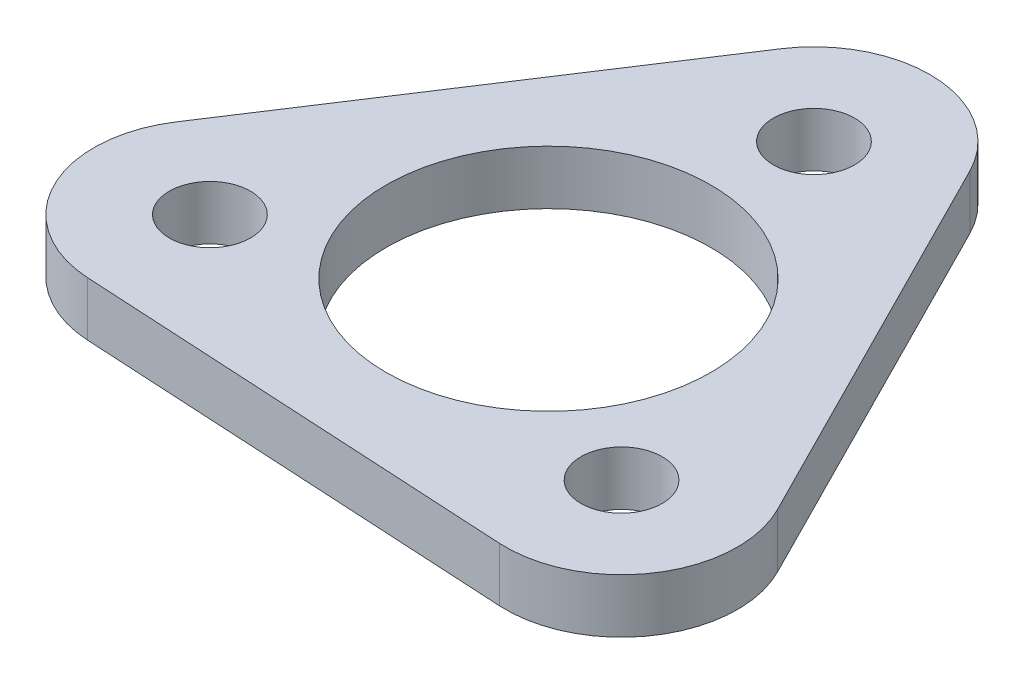
ISO-10303-21;
HEADER;
FILE_DESCRIPTION(('STEP AP214'),'2;1');
FILE_NAME('part.step','',(''),(''),'','','');
FILE_SCHEMA(('AUTOMOTIVE_DESIGN { 1 0 10303 214 1 1 1 1 }'));
ENDSEC;
DATA;
#1=APPLICATION_CONTEXT('core data for automotive mechanical design processes');
#2=APPLICATION_PROTOCOL_DEFINITION('international standard','automotive_design',2000,#1);
#3=PRODUCT_CONTEXT('',#1,'mechanical');
#4=PRODUCT('Part','Part','',(#3));
#5=PRODUCT_RELATED_PRODUCT_CATEGORY('part','',(#4));
#6=PRODUCT_DEFINITION_FORMATION('','',#4);
#7=PRODUCT_DEFINITION_CONTEXT('part definition',#1,'design');
#8=PRODUCT_DEFINITION('design','',#6,#7);
#9=PRODUCT_DEFINITION_SHAPE('','',#8);
#10=(LENGTH_UNIT() NAMED_UNIT(*) SI_UNIT(.MILLI.,.METRE.));
#11=(NAMED_UNIT(*) PLANE_ANGLE_UNIT() SI_UNIT($,.RADIAN.));
#12=(NAMED_UNIT(*) SI_UNIT($,.STERADIAN.) SOLID_ANGLE_UNIT());
#13=UNCERTAINTY_MEASURE_WITH_UNIT(LENGTH_MEASURE(1.E-05),#10,'distance_accuracy_value','');
#14=(GEOMETRIC_REPRESENTATION_CONTEXT(3) GLOBAL_UNCERTAINTY_ASSIGNED_CONTEXT((#13)) GLOBAL_UNIT_ASSIGNED_CONTEXT((#10,
#11,#12)) REPRESENTATION_CONTEXT('',''));
#15=CARTESIAN_POINT('',(0.,0.,0.));
#16=DIRECTION('',(0.,0.,1.));
#17=DIRECTION('',(1.,0.,0.));
#18=AXIS2_PLACEMENT_3D('',#15,#16,#17);
#19=CARTESIAN_POINT('',(0.0513926981691674,0.2,-0.929533933395298));
#20=DIRECTION('',(0.,1.,0.));
#21=DIRECTION('',(0.,0.,1.));
#22=AXIS2_PLACEMENT_3D('',#19,#20,#21);
#23=PLANE('',#22);
#24=CARTESIAN_POINT('',(0.779303650915417,0.2,0.509274348881175));
#25=DIRECTION('',(0.,1.,0.));
#26=DIRECTION('',(0.,0.,1.));
#27=AXIS2_PLACEMENT_3D('',#24,#25,#26);
#28=CIRCLE('',#27,0.15);
#29=CARTESIAN_POINT('',(0.779303650915417,0.2,0.659274348881175));
#30=VERTEX_POINT('',#29);
#31=EDGE_CURVE('E274',#30,#30,#28,.T.);
#32=ORIENTED_EDGE('',*,*,#31,.F.);
#33=EDGE_LOOP('',(#32));
#34=FACE_BOUND('',#33,.T.);
#35=CARTESIAN_POINT('',(0.,0.2,0.));
#36=DIRECTION('',(0.,1.,0.));
#37=DIRECTION('',(0.,0.,1.));
#38=AXIS2_PLACEMENT_3D('',#35,#36,#37);
#39=CIRCLE('',#38,0.6);
#40=CARTESIAN_POINT('',(0.,0.2,0.6));
#41=VERTEX_POINT('',#40);
#42=EDGE_CURVE('E206',#41,#41,#39,.T.);
#43=ORIENTED_EDGE('',*,*,#42,.F.);
#44=EDGE_LOOP('',(#43));
#45=FACE_BOUND('',#44,.T.);
#46=DIRECTION('',(-0.451429157898425,0.,-0.892306962540985));
#47=VECTOR('',#46,1.);
#48=CARTESIAN_POINT('',(1.16172676402611,0.2,0.31580175350788));
#49=LINE('',#48,#47);
#50=CARTESIAN_POINT('',(1.1617267640261,0.2,0.315801753507887));
#51=VERTEX_POINT('',#50);
#52=CARTESIAN_POINT('',(0.433815811279854,0.2,-1.12300652876858));
#53=VERTEX_POINT('',#52);
#54=EDGE_CURVE('E214',#51,#53,#49,.T.);
#55=ORIENTED_EDGE('',*,*,#54,.T.);
#56=CARTESIAN_POINT('',(0.0513926981691674,0.2,-0.929533933395298));
#57=DIRECTION('',(0.,1.,0.));
#58=DIRECTION('',(0.,0.,1.));
#59=AXIS2_PLACEMENT_3D('',#56,#57,#58);
#60=CIRCLE('',#59,0.428577977271049);
#61=CARTESIAN_POINT('',(-0.30737104091555,0.2,-1.16398576665684));
#62=VERTEX_POINT('',#61);
#63=EDGE_CURVE('E170',#53,#62,#60,.T.);
#64=ORIENTED_EDGE('',*,*,#63,.T.);
#65=DIRECTION('',(-0.54704591858501,0.,0.837102600019545));
#66=VECTOR('',#65,1.);
#67=CARTESIAN_POINT('',(-0.307371040915561,0.2,-1.16398576665685));
#68=LINE('',#67,#66);
#69=CARTESIAN_POINT('',(-1.18946008816929,0.2,0.18580775125259));
#70=VERTEX_POINT('',#69);
#71=EDGE_CURVE('E194',#62,#70,#68,.T.);
#72=ORIENTED_EDGE('',*,*,#71,.T.);
#73=CARTESIAN_POINT('',(-0.830696349084583,0.2,0.420259584514123));
#74=DIRECTION('',(0.,-1.,0.));
#75=DIRECTION('',(0.,0.,-1.));
#76=AXIS2_PLACEMENT_3D('',#73,#74,#75);
#77=CIRCLE('',#76,0.42857797727105);
#78=CARTESIAN_POINT('',(-0.854355723110552,0.2,0.848184013148951));
#79=VERTEX_POINT('',#78);
#80=EDGE_CURVE('E183',#79,#70,#77,.T.);
#81=ORIENTED_EDGE('',*,*,#80,.F.);
#82=DIRECTION('',(0.998475076483435,0.,0.0552043625214403));
#83=VECTOR('',#82,1.);
#84=CARTESIAN_POINT('',(-0.854355723110553,0.2,0.848184013148965));
#85=LINE('',#84,#83);
#86=CARTESIAN_POINT('',(0.755644276889447,0.2,0.937198777515988));
#87=VERTEX_POINT('',#86);
#88=EDGE_CURVE('E189',#79,#87,#85,.T.);
#89=ORIENTED_EDGE('',*,*,#88,.T.);
#90=CARTESIAN_POINT('',(0.779303650915417,0.2,0.509274348881175));
#91=DIRECTION('',(0.,1.,0.));
#92=DIRECTION('',(0.,0.,1.));
#93=AXIS2_PLACEMENT_3D('',#90,#91,#92);
#94=CIRCLE('',#93,0.428577977271049);
#95=EDGE_CURVE('E134',#87,#51,#94,.T.);
#96=ORIENTED_EDGE('',*,*,#95,.T.);
#97=EDGE_LOOP('',(#55,#64,#72,#81,#89,#96));
#98=FACE_BOUND('',#97,.T.);
#99=CARTESIAN_POINT('',(-0.830696349084583,0.2,0.420259584514123));
#100=DIRECTION('',(0.,1.,0.));
#101=DIRECTION('',(0.,0.,1.));
#102=AXIS2_PLACEMENT_3D('',#99,#100,#101);
#103=CIRCLE('',#102,0.15);
#104=CARTESIAN_POINT('',(-0.830696349084583,0.2,0.570259584514123));
#105=VERTEX_POINT('',#104);
#106=EDGE_CURVE('E280',#105,#105,#103,.T.);
#107=ORIENTED_EDGE('',*,*,#106,.F.);
#108=EDGE_LOOP('',(#107));
#109=FACE_BOUND('',#108,.T.);
#110=CARTESIAN_POINT('',(0.0513926981691674,0.2,-0.929533933395298));
#111=DIRECTION('',(0.,1.,0.));
#112=DIRECTION('',(0.,0.,1.));
#113=AXIS2_PLACEMENT_3D('',#110,#111,#112);
#114=CIRCLE('',#113,0.15);
#115=CARTESIAN_POINT('',(0.0513926981691674,0.2,-0.779533933395298));
#116=VERTEX_POINT('',#115);
#117=EDGE_CURVE('E265',#116,#116,#114,.T.);
#118=ORIENTED_EDGE('',*,*,#117,.F.);
#119=EDGE_LOOP('',(#118));
#120=FACE_BOUND('',#119,.T.);
#121=ADVANCED_FACE('F117',(#34,#45,#98,#109,#120),#23,.T.);
#122=CARTESIAN_POINT('',(0.0513926981691674,0.,-0.929533933395298));
#123=DIRECTION('',(0.,1.,0.));
#124=DIRECTION('',(0.,0.,1.));
#125=AXIS2_PLACEMENT_3D('',#122,#123,#124);
#126=PLANE('',#125);
#127=DIRECTION('',(-0.451429157898425,0.,-0.892306962540985));
#128=VECTOR('',#127,1.);
#129=CARTESIAN_POINT('',(1.16172676402611,0.,0.31580175350788));
#130=LINE('',#129,#128);
#131=CARTESIAN_POINT('',(1.1617267640261,0.,0.315801753507887));
#132=VERTEX_POINT('',#131);
#133=CARTESIAN_POINT('',(0.433815811279854,0.,-1.12300652876858));
#134=VERTEX_POINT('',#133);
#135=EDGE_CURVE('E202',#132,#134,#130,.T.);
#136=ORIENTED_EDGE('',*,*,#135,.F.);
#137=CARTESIAN_POINT('',(0.779303650915417,0.,0.509274348881175));
#138=DIRECTION('',(0.,1.,0.));
#139=DIRECTION('',(0.,0.,1.));
#140=AXIS2_PLACEMENT_3D('',#137,#138,#139);
#141=CIRCLE('',#140,0.428577977271049);
#142=CARTESIAN_POINT('',(0.755644276889447,0.,0.937198777515988));
#143=VERTEX_POINT('',#142);
#144=EDGE_CURVE('E162',#143,#132,#141,.T.);
#145=ORIENTED_EDGE('',*,*,#144,.F.);
#146=DIRECTION('',(0.998475076483435,0.,0.0552043625214403));
#147=VECTOR('',#146,1.);
#148=CARTESIAN_POINT('',(-0.854355723110553,0.,0.848184013148965));
#149=LINE('',#148,#147);
#150=CARTESIAN_POINT('',(-0.854355723110552,0.,0.848184013148951));
#151=VERTEX_POINT('',#150);
#152=EDGE_CURVE('E156',#151,#143,#149,.T.);
#153=ORIENTED_EDGE('',*,*,#152,.F.);
#154=CARTESIAN_POINT('',(-0.830696349084583,0.,0.420259584514123));
#155=DIRECTION('',(0.,-1.,0.));
#156=DIRECTION('',(0.,0.,-1.));
#157=AXIS2_PLACEMENT_3D('',#154,#155,#156);
#158=CIRCLE('',#157,0.42857797727105);
#159=CARTESIAN_POINT('',(-1.18946008816929,0.,0.18580775125259));
#160=VERTEX_POINT('',#159);
#161=EDGE_CURVE('E185',#151,#160,#158,.T.);
#162=ORIENTED_EDGE('',*,*,#161,.T.);
#163=DIRECTION('',(-0.54704591858501,0.,0.837102600019545));
#164=VECTOR('',#163,1.);
#165=CARTESIAN_POINT('',(-0.307371040915561,0.,-1.16398576665685));
#166=LINE('',#165,#164);
#167=CARTESIAN_POINT('',(-0.30737104091555,0.,-1.16398576665684));
#168=VERTEX_POINT('',#167);
#169=EDGE_CURVE('E208',#168,#160,#166,.T.);
#170=ORIENTED_EDGE('',*,*,#169,.F.);
#171=CARTESIAN_POINT('',(0.0513926981691674,0.,-0.929533933395298));
#172=DIRECTION('',(0.,1.,0.));
#173=DIRECTION('',(0.,0.,1.));
#174=AXIS2_PLACEMENT_3D('',#171,#172,#173);
#175=CIRCLE('',#174,0.428577977271049);
#176=EDGE_CURVE('E205',#134,#168,#175,.T.);
#177=ORIENTED_EDGE('',*,*,#176,.F.);
#178=EDGE_LOOP('',(#136,#145,#153,#162,#170,#177));
#179=FACE_BOUND('',#178,.T.);
#180=CARTESIAN_POINT('',(0.,0.,0.));
#181=DIRECTION('',(0.,1.,0.));
#182=DIRECTION('',(0.,0.,1.));
#183=AXIS2_PLACEMENT_3D('',#180,#181,#182);
#184=CIRCLE('',#183,0.6);
#185=CARTESIAN_POINT('',(0.,0.,0.6));
#186=VERTEX_POINT('',#185);
#187=EDGE_CURVE('E283',#186,#186,#184,.T.);
#188=ORIENTED_EDGE('',*,*,#187,.T.);
#189=EDGE_LOOP('',(#188));
#190=FACE_BOUND('',#189,.T.);
#191=CARTESIAN_POINT('',(-0.830696349084583,0.,0.420259584514123));
#192=DIRECTION('',(0.,1.,0.));
#193=DIRECTION('',(0.,0.,1.));
#194=AXIS2_PLACEMENT_3D('',#191,#192,#193);
#195=CIRCLE('',#194,0.15);
#196=CARTESIAN_POINT('',(-0.830696349084583,0.,0.570259584514123));
#197=VERTEX_POINT('',#196);
#198=EDGE_CURVE('E277',#197,#197,#195,.T.);
#199=ORIENTED_EDGE('',*,*,#198,.T.);
#200=EDGE_LOOP('',(#199));
#201=FACE_BOUND('',#200,.T.);
#202=CARTESIAN_POINT('',(0.779303650915417,0.,0.509274348881175));
#203=DIRECTION('',(0.,1.,0.));
#204=DIRECTION('',(0.,0.,1.));
#205=AXIS2_PLACEMENT_3D('',#202,#203,#204);
#206=CIRCLE('',#205,0.15);
#207=CARTESIAN_POINT('',(0.779303650915417,0.,0.659274348881175));
#208=VERTEX_POINT('',#207);
#209=EDGE_CURVE('E271',#208,#208,#206,.T.);
#210=ORIENTED_EDGE('',*,*,#209,.T.);
#211=EDGE_LOOP('',(#210));
#212=FACE_BOUND('',#211,.T.);
#213=CARTESIAN_POINT('',(0.0513926981691674,0.,-0.929533933395298));
#214=DIRECTION('',(0.,1.,0.));
#215=DIRECTION('',(0.,0.,1.));
#216=AXIS2_PLACEMENT_3D('',#213,#214,#215);
#217=CIRCLE('',#216,0.15);
#218=CARTESIAN_POINT('',(0.0513926981691674,0.,-0.779533933395298));
#219=VERTEX_POINT('',#218);
#220=EDGE_CURVE('E268',#219,#219,#217,.T.);
#221=ORIENTED_EDGE('',*,*,#220,.T.);
#222=EDGE_LOOP('',(#221));
#223=FACE_BOUND('',#222,.T.);
#224=ADVANCED_FACE('F223',(#179,#190,#201,#212,#223),#126,.F.);
#225=CARTESIAN_POINT('',(1.16172676402611,0.2,0.31580175350788));
#226=DIRECTION('',(-0.892306962540985,0.,0.451429157898425));
#227=DIRECTION('',(0.451429157898425,0.,0.892306962540985));
#228=AXIS2_PLACEMENT_3D('',#225,#226,#227);
#229=PLANE('',#228);
#230=ORIENTED_EDGE('',*,*,#135,.T.);
#231=DIRECTION('',(0.,-1.,0.));
#232=VECTOR('',#231,1.);
#233=CARTESIAN_POINT('',(0.433815811279854,0.2,-1.12300652876858));
#234=LINE('',#233,#232);
#235=EDGE_CURVE('E12',#53,#134,#234,.T.);
#236=ORIENTED_EDGE('',*,*,#235,.F.);
#237=ORIENTED_EDGE('',*,*,#54,.F.);
#238=DIRECTION('',(0.,-1.,0.));
#239=VECTOR('',#238,1.);
#240=CARTESIAN_POINT('',(1.1617267640261,0.2,0.315801753507887));
#241=LINE('',#240,#239);
#242=EDGE_CURVE('E201',#51,#132,#241,.T.);
#243=ORIENTED_EDGE('',*,*,#242,.T.);
#244=EDGE_LOOP('',(#230,#236,#237,#243));
#245=FACE_BOUND('',#244,.T.);
#246=ADVANCED_FACE('F119',(#245),#229,.F.);
#247=CARTESIAN_POINT('',(0.0513926981691674,0.2,-0.929533933395298));
#248=DIRECTION('',(0.,-1.,0.));
#249=DIRECTION('',(0.,0.,-1.));
#250=AXIS2_PLACEMENT_3D('',#247,#248,#249);
#251=CYLINDRICAL_SURFACE('',#250,0.428577977271049);
#252=ORIENTED_EDGE('',*,*,#176,.T.);
#253=DIRECTION('',(0.,-1.,0.));
#254=VECTOR('',#253,1.);
#255=CARTESIAN_POINT('',(-0.30737104091555,0.2,-1.16398576665684));
#256=LINE('',#255,#254);
#257=EDGE_CURVE('E126',#62,#168,#256,.T.);
#258=ORIENTED_EDGE('',*,*,#257,.F.);
#259=ORIENTED_EDGE('',*,*,#63,.F.);
#260=ORIENTED_EDGE('',*,*,#235,.T.);
#261=EDGE_LOOP('',(#252,#258,#259,#260));
#262=FACE_BOUND('',#261,.T.);
#263=ADVANCED_FACE('F340',(#262),#251,.T.);
#264=CARTESIAN_POINT('',(-0.307371040915561,0.2,-1.16398576665685));
#265=DIRECTION('',(0.837102600019545,0.,0.54704591858501));
#266=DIRECTION('',(0.54704591858501,0.,-0.837102600019545));
#267=AXIS2_PLACEMENT_3D('',#264,#265,#266);
#268=PLANE('',#267);
#269=ORIENTED_EDGE('',*,*,#169,.T.);
#270=DIRECTION('',(0.,-1.,0.));
#271=VECTOR('',#270,1.);
#272=CARTESIAN_POINT('',(-1.18946008816929,0.2,0.18580775125259));
#273=LINE('',#272,#271);
#274=EDGE_CURVE('E186',#70,#160,#273,.T.);
#275=ORIENTED_EDGE('',*,*,#274,.F.);
#276=ORIENTED_EDGE('',*,*,#71,.F.);
#277=ORIENTED_EDGE('',*,*,#257,.T.);
#278=EDGE_LOOP('',(#269,#275,#276,#277));
#279=FACE_BOUND('',#278,.T.);
#280=ADVANCED_FACE('F220',(#279),#268,.F.);
#281=CARTESIAN_POINT('',(-0.830696349084583,0.2,0.420259584514123));
#282=DIRECTION('',(0.,-1.,0.));
#283=DIRECTION('',(0.,0.,-1.));
#284=AXIS2_PLACEMENT_3D('',#281,#282,#283);
#285=CYLINDRICAL_SURFACE('',#284,0.42857797727105);
#286=ORIENTED_EDGE('',*,*,#161,.F.);
#287=DIRECTION('',(0.,-1.,0.));
#288=VECTOR('',#287,1.);
#289=CARTESIAN_POINT('',(-0.854355723110552,0.2,0.848184013148951));
#290=LINE('',#289,#288);
#291=EDGE_CURVE('E179',#79,#151,#290,.T.);
#292=ORIENTED_EDGE('',*,*,#291,.F.);
#293=ORIENTED_EDGE('',*,*,#80,.T.);
#294=ORIENTED_EDGE('',*,*,#274,.T.);
#295=EDGE_LOOP('',(#286,#292,#293,#294));
#296=FACE_BOUND('',#295,.T.);
#297=ADVANCED_FACE('F181',(#296),#285,.T.);
#298=CARTESIAN_POINT('',(-0.854355723110553,0.2,0.848184013148965));
#299=DIRECTION('',(0.0552043625214403,0.,-0.998475076483435));
#300=DIRECTION('',(-0.998475076483435,0.,-0.0552043625214403));
#301=AXIS2_PLACEMENT_3D('',#298,#299,#300);
#302=PLANE('',#301);
#303=ORIENTED_EDGE('',*,*,#152,.T.);
#304=DIRECTION('',(0.,-1.,0.));
#305=VECTOR('',#304,1.);
#306=CARTESIAN_POINT('',(0.755644276889447,0.2,0.937198777515988));
#307=LINE('',#306,#305);
#308=EDGE_CURVE('E187',#87,#143,#307,.T.);
#309=ORIENTED_EDGE('',*,*,#308,.F.);
#310=ORIENTED_EDGE('',*,*,#88,.F.);
#311=ORIENTED_EDGE('',*,*,#291,.T.);
#312=EDGE_LOOP('',(#303,#309,#310,#311));
#313=FACE_BOUND('',#312,.T.);
#314=ADVANCED_FACE('F190',(#313),#302,.F.);
#315=CARTESIAN_POINT('',(0.779303650915417,0.2,0.509274348881175));
#316=DIRECTION('',(0.,-1.,0.));
#317=DIRECTION('',(0.,0.,-1.));
#318=AXIS2_PLACEMENT_3D('',#315,#316,#317);
#319=CYLINDRICAL_SURFACE('',#318,0.428577977271049);
#320=ORIENTED_EDGE('',*,*,#144,.T.);
#321=ORIENTED_EDGE('',*,*,#242,.F.);
#322=ORIENTED_EDGE('',*,*,#95,.F.);
#323=ORIENTED_EDGE('',*,*,#308,.T.);
#324=EDGE_LOOP('',(#320,#321,#322,#323));
#325=FACE_BOUND('',#324,.T.);
#326=ADVANCED_FACE('F228',(#325),#319,.T.);
#327=CARTESIAN_POINT('',(0.,0.2,0.));
#328=DIRECTION('',(0.,-1.,0.));
#329=DIRECTION('',(0.,0.,-1.));
#330=AXIS2_PLACEMENT_3D('',#327,#328,#329);
#331=CYLINDRICAL_SURFACE('',#330,0.6);
#332=ORIENTED_EDGE('',*,*,#42,.T.);
#333=EDGE_LOOP('',(#332));
#334=FACE_BOUND('',#333,.T.);
#335=ORIENTED_EDGE('',*,*,#187,.F.);
#336=EDGE_LOOP('',(#335));
#337=FACE_BOUND('',#336,.T.);
#338=ADVANCED_FACE('F230',(#334,#337),#331,.F.);
#339=CARTESIAN_POINT('',(-0.830696349084583,0.2,0.420259584514123));
#340=DIRECTION('',(0.,-1.,0.));
#341=DIRECTION('',(0.,0.,-1.));
#342=AXIS2_PLACEMENT_3D('',#339,#340,#341);
#343=CYLINDRICAL_SURFACE('',#342,0.15);
#344=ORIENTED_EDGE('',*,*,#106,.T.);
#345=EDGE_LOOP('',(#344));
#346=FACE_BOUND('',#345,.T.);
#347=ORIENTED_EDGE('',*,*,#198,.F.);
#348=EDGE_LOOP('',(#347));
#349=FACE_BOUND('',#348,.T.);
#350=ADVANCED_FACE('F236',(#346,#349),#343,.F.);
#351=CARTESIAN_POINT('',(0.779303650915417,0.2,0.509274348881175));
#352=DIRECTION('',(0.,-1.,0.));
#353=DIRECTION('',(0.,0.,-1.));
#354=AXIS2_PLACEMENT_3D('',#351,#352,#353);
#355=CYLINDRICAL_SURFACE('',#354,0.15);
#356=ORIENTED_EDGE('',*,*,#31,.T.);
#357=EDGE_LOOP('',(#356));
#358=FACE_BOUND('',#357,.T.);
#359=ORIENTED_EDGE('',*,*,#209,.F.);
#360=EDGE_LOOP('',(#359));
#361=FACE_BOUND('',#360,.T.);
#362=ADVANCED_FACE('F252',(#358,#361),#355,.F.);
#363=CARTESIAN_POINT('',(0.0513926981691674,0.2,-0.929533933395298));
#364=DIRECTION('',(0.,-1.,0.));
#365=DIRECTION('',(0.,0.,-1.));
#366=AXIS2_PLACEMENT_3D('',#363,#364,#365);
#367=CYLINDRICAL_SURFACE('',#366,0.15);
#368=ORIENTED_EDGE('',*,*,#117,.T.);
#369=EDGE_LOOP('',(#368));
#370=FACE_BOUND('',#369,.T.);
#371=ORIENTED_EDGE('',*,*,#220,.F.);
#372=EDGE_LOOP('',(#371));
#373=FACE_BOUND('',#372,.T.);
#374=ADVANCED_FACE('F256',(#370,#373),#367,.F.);
#375=CLOSED_SHELL('',(#121,#224,#246,#263,#280,#297,#314,#326,#338,#350,#362,#374));
#376=MANIFOLD_SOLID_BREP('B2',#375);
#377=ADVANCED_BREP_SHAPE_REPRESENTATION('',(#18,#376),#14);
#378=SHAPE_DEFINITION_REPRESENTATION(#9,#377);
ENDSEC;
END-ISO-10303-21;
